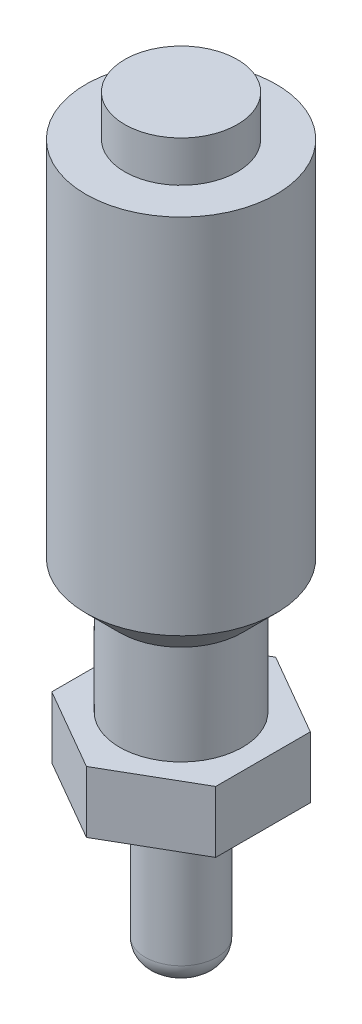
ISO-10303-21;
HEADER;
FILE_DESCRIPTION(('STEP AP214'),'2;1');
FILE_NAME('part.step','',(''),(''),'','','');
FILE_SCHEMA(('AUTOMOTIVE_DESIGN { 1 0 10303 214 1 1 1 1 }'));
ENDSEC;
DATA;
#1=APPLICATION_CONTEXT('core data for automotive mechanical design processes');
#2=APPLICATION_PROTOCOL_DEFINITION('international standard','automotive_design',2000,#1);
#3=PRODUCT_CONTEXT('',#1,'mechanical');
#4=PRODUCT('Part','Part','',(#3));
#5=PRODUCT_RELATED_PRODUCT_CATEGORY('part','',(#4));
#6=PRODUCT_DEFINITION_FORMATION('','',#4);
#7=PRODUCT_DEFINITION_CONTEXT('part definition',#1,'design');
#8=PRODUCT_DEFINITION('design','',#6,#7);
#9=PRODUCT_DEFINITION_SHAPE('','',#8);
#10=(LENGTH_UNIT() NAMED_UNIT(*) SI_UNIT(.MILLI.,.METRE.));
#11=(NAMED_UNIT(*) PLANE_ANGLE_UNIT() SI_UNIT($,.RADIAN.));
#12=(NAMED_UNIT(*) SI_UNIT($,.STERADIAN.) SOLID_ANGLE_UNIT());
#13=UNCERTAINTY_MEASURE_WITH_UNIT(LENGTH_MEASURE(1.E-05),#10,'distance_accuracy_value','');
#14=(GEOMETRIC_REPRESENTATION_CONTEXT(3) GLOBAL_UNCERTAINTY_ASSIGNED_CONTEXT((#13)) GLOBAL_UNIT_ASSIGNED_CONTEXT((#10,
#11,#12)) REPRESENTATION_CONTEXT('',''));
#15=CARTESIAN_POINT('',(0.,0.,0.));
#16=DIRECTION('',(0.,0.,1.));
#17=DIRECTION('',(1.,0.,0.));
#18=AXIS2_PLACEMENT_3D('',#15,#16,#17);
#19=CARTESIAN_POINT('',(0.,36.7,0.));
#20=DIRECTION('',(0.,-1.,0.));
#21=DIRECTION('',(0.,0.,-1.));
#22=AXIS2_PLACEMENT_3D('',#19,#20,#21);
#23=CYLINDRICAL_SURFACE('',#22,4.65);
#24=CARTESIAN_POINT('',(0.,17.,0.));
#25=DIRECTION('',(0.,1.,0.));
#26=DIRECTION('',(0.,0.,1.));
#27=AXIS2_PLACEMENT_3D('',#24,#25,#26);
#28=CIRCLE('',#27,4.65);
#29=CARTESIAN_POINT('',(0.,17.,4.65));
#30=VERTEX_POINT('',#29);
#31=EDGE_CURVE('E54',#30,#30,#28,.T.);
#32=ORIENTED_EDGE('',*,*,#31,.T.);
#33=EDGE_LOOP('',(#32));
#34=FACE_BOUND('',#33,.T.);
#35=CARTESIAN_POINT('',(0.,34.7,0.));
#36=DIRECTION('',(0.,1.,0.));
#37=DIRECTION('',(0.,0.,1.));
#38=AXIS2_PLACEMENT_3D('',#35,#36,#37);
#39=CIRCLE('',#38,4.65);
#40=CARTESIAN_POINT('',(0.,34.7,4.65));
#41=VERTEX_POINT('',#40);
#42=EDGE_CURVE('E143',#41,#41,#39,.T.);
#43=ORIENTED_EDGE('',*,*,#42,.F.);
#44=EDGE_LOOP('',(#43));
#45=FACE_BOUND('',#44,.T.);
#46=ADVANCED_FACE('F43',(#34,#45),#23,.T.);
#47=CARTESIAN_POINT('',(0.,15.,0.));
#48=DIRECTION('',(0.,-1.,0.));
#49=DIRECTION('',(0.,0.,-1.));
#50=AXIS2_PLACEMENT_3D('',#47,#48,#49);
#51=CYLINDRICAL_SURFACE('',#50,3.);
#52=CARTESIAN_POINT('',(0.,15.35,0.));
#53=DIRECTION('',(0.,1.,0.));
#54=DIRECTION('',(0.,0.,1.));
#55=AXIS2_PLACEMENT_3D('',#52,#53,#54);
#56=CIRCLE('',#55,3.);
#57=CARTESIAN_POINT('',(0.,15.35,3.));
#58=VERTEX_POINT('',#57);
#59=EDGE_CURVE('E11',#58,#58,#56,.F.);
#60=ORIENTED_EDGE('',*,*,#59,.T.);
#61=EDGE_LOOP('',(#60));
#62=FACE_BOUND('',#61,.T.);
#63=CARTESIAN_POINT('',(0.,10.5,0.));
#64=DIRECTION('',(0.,-1.,0.));
#65=DIRECTION('',(0.,0.,-1.));
#66=AXIS2_PLACEMENT_3D('',#63,#64,#65);
#67=CIRCLE('',#66,3.);
#68=CARTESIAN_POINT('',(0.,10.5,-3.));
#69=VERTEX_POINT('',#68);
#70=EDGE_CURVE('E184',#69,#69,#67,.T.);
#71=ORIENTED_EDGE('',*,*,#70,.F.);
#72=EDGE_LOOP('',(#71));
#73=FACE_BOUND('',#72,.T.);
#74=ADVANCED_FACE('F204',(#62,#73),#51,.T.);
#75=CARTESIAN_POINT('',(3.99999999999999,10.5,2.30940107675851));
#76=DIRECTION('',(0.5,0.,0.866025403784439));
#77=DIRECTION('',(0.866025403784439,0.,-0.5));
#78=AXIS2_PLACEMENT_3D('',#75,#76,#77);
#79=PLANE('',#78);
#80=DIRECTION('',(-0.866025403784439,0.,0.5));
#81=VECTOR('',#80,1.);
#82=CARTESIAN_POINT('',(3.99999999999999,7.5,2.30940107675851));
#83=LINE('',#82,#81);
#84=CARTESIAN_POINT('',(3.99999999999999,7.5,2.30940107675851));
#85=VERTEX_POINT('',#84);
#86=CARTESIAN_POINT('',(0.,7.5,4.61880215351701));
#87=VERTEX_POINT('',#86);
#88=EDGE_CURVE('E138',#85,#87,#83,.T.);
#89=ORIENTED_EDGE('',*,*,#88,.F.);
#90=DIRECTION('',(0.,-1.,0.));
#91=VECTOR('',#90,1.);
#92=CARTESIAN_POINT('',(3.99999999999999,10.5,2.30940107675851));
#93=LINE('',#92,#91);
#94=CARTESIAN_POINT('',(3.99999999999999,10.5,2.30940107675851));
#95=VERTEX_POINT('',#94);
#96=EDGE_CURVE('E62',#95,#85,#93,.T.);
#97=ORIENTED_EDGE('',*,*,#96,.F.);
#98=DIRECTION('',(-0.866025403784439,0.,0.5));
#99=VECTOR('',#98,1.);
#100=CARTESIAN_POINT('',(3.99999999999999,10.5,2.30940107675851));
#101=LINE('',#100,#99);
#102=CARTESIAN_POINT('',(0.,10.5,4.61880215351701));
#103=VERTEX_POINT('',#102);
#104=EDGE_CURVE('E160',#95,#103,#101,.T.);
#105=ORIENTED_EDGE('',*,*,#104,.T.);
#106=DIRECTION('',(0.,-1.,0.));
#107=VECTOR('',#106,1.);
#108=CARTESIAN_POINT('',(0.,10.5,4.61880215351701));
#109=LINE('',#108,#107);
#110=EDGE_CURVE('E97',#103,#87,#109,.T.);
#111=ORIENTED_EDGE('',*,*,#110,.T.);
#112=EDGE_LOOP('',(#89,#97,#105,#111));
#113=FACE_BOUND('',#112,.T.);
#114=ADVANCED_FACE('F209',(#113),#79,.T.);
#115=CARTESIAN_POINT('',(4.,10.5,-2.3094010767585));
#116=DIRECTION('',(1.,0.,0.));
#117=DIRECTION('',(0.,0.,-1.));
#118=AXIS2_PLACEMENT_3D('',#115,#116,#117);
#119=PLANE('',#118);
#120=DIRECTION('',(0.,0.,1.));
#121=VECTOR('',#120,1.);
#122=CARTESIAN_POINT('',(4.,7.5,-2.3094010767585));
#123=LINE('',#122,#121);
#124=CARTESIAN_POINT('',(4.,7.5,-2.3094010767585));
#125=VERTEX_POINT('',#124);
#126=EDGE_CURVE('E156',#125,#85,#123,.T.);
#127=ORIENTED_EDGE('',*,*,#126,.F.);
#128=DIRECTION('',(0.,-1.,0.));
#129=VECTOR('',#128,1.);
#130=CARTESIAN_POINT('',(4.,10.5,-2.3094010767585));
#131=LINE('',#130,#129);
#132=CARTESIAN_POINT('',(4.,10.5,-2.3094010767585));
#133=VERTEX_POINT('',#132);
#134=EDGE_CURVE('E85',#133,#125,#131,.T.);
#135=ORIENTED_EDGE('',*,*,#134,.F.);
#136=DIRECTION('',(0.,0.,1.));
#137=VECTOR('',#136,1.);
#138=CARTESIAN_POINT('',(4.,10.5,-2.3094010767585));
#139=LINE('',#138,#137);
#140=EDGE_CURVE('E124',#133,#95,#139,.T.);
#141=ORIENTED_EDGE('',*,*,#140,.T.);
#142=ORIENTED_EDGE('',*,*,#96,.T.);
#143=EDGE_LOOP('',(#127,#135,#141,#142));
#144=FACE_BOUND('',#143,.T.);
#145=ADVANCED_FACE('F241',(#144),#119,.T.);
#146=CARTESIAN_POINT('',(0.,10.5,-4.618802153517));
#147=DIRECTION('',(0.5,0.,-0.866025403784439));
#148=DIRECTION('',(-0.866025403784439,0.,-0.5));
#149=AXIS2_PLACEMENT_3D('',#146,#147,#148);
#150=PLANE('',#149);
#151=DIRECTION('',(0.866025403784439,0.,0.5));
#152=VECTOR('',#151,1.);
#153=CARTESIAN_POINT('',(0.,7.5,-4.618802153517));
#154=LINE('',#153,#152);
#155=CARTESIAN_POINT('',(0.,7.5,-4.618802153517));
#156=VERTEX_POINT('',#155);
#157=EDGE_CURVE('E110',#156,#125,#154,.T.);
#158=ORIENTED_EDGE('',*,*,#157,.F.);
#159=DIRECTION('',(0.,-1.,0.));
#160=VECTOR('',#159,1.);
#161=CARTESIAN_POINT('',(0.,10.5,-4.618802153517));
#162=LINE('',#161,#160);
#163=CARTESIAN_POINT('',(0.,10.5,-4.618802153517));
#164=VERTEX_POINT('',#163);
#165=EDGE_CURVE('E105',#164,#156,#162,.T.);
#166=ORIENTED_EDGE('',*,*,#165,.F.);
#167=DIRECTION('',(0.866025403784439,0.,0.5));
#168=VECTOR('',#167,1.);
#169=CARTESIAN_POINT('',(0.,10.5,-4.618802153517));
#170=LINE('',#169,#168);
#171=EDGE_CURVE('E108',#164,#133,#170,.T.);
#172=ORIENTED_EDGE('',*,*,#171,.T.);
#173=ORIENTED_EDGE('',*,*,#134,.T.);
#174=EDGE_LOOP('',(#158,#166,#172,#173));
#175=FACE_BOUND('',#174,.T.);
#176=ADVANCED_FACE('F107',(#175),#150,.T.);
#177=CARTESIAN_POINT('',(-4.,10.5,-2.3094010767585));
#178=DIRECTION('',(-0.5,0.,-0.866025403784439));
#179=DIRECTION('',(-0.866025403784439,0.,0.5));
#180=AXIS2_PLACEMENT_3D('',#177,#178,#179);
#181=PLANE('',#180);
#182=DIRECTION('',(0.866025403784439,0.,-0.5));
#183=VECTOR('',#182,1.);
#184=CARTESIAN_POINT('',(-4.,7.5,-2.3094010767585));
#185=LINE('',#184,#183);
#186=CARTESIAN_POINT('',(-4.,7.5,-2.3094010767585));
#187=VERTEX_POINT('',#186);
#188=EDGE_CURVE('E151',#187,#156,#185,.T.);
#189=ORIENTED_EDGE('',*,*,#188,.F.);
#190=DIRECTION('',(0.,-1.,0.));
#191=VECTOR('',#190,1.);
#192=CARTESIAN_POINT('',(-4.,10.5,-2.3094010767585));
#193=LINE('',#192,#191);
#194=CARTESIAN_POINT('',(-4.,10.5,-2.3094010767585));
#195=VERTEX_POINT('',#194);
#196=EDGE_CURVE('E116',#195,#187,#193,.T.);
#197=ORIENTED_EDGE('',*,*,#196,.F.);
#198=DIRECTION('',(0.866025403784439,0.,-0.5));
#199=VECTOR('',#198,1.);
#200=CARTESIAN_POINT('',(-4.,10.5,-2.3094010767585));
#201=LINE('',#200,#199);
#202=EDGE_CURVE('E122',#195,#164,#201,.T.);
#203=ORIENTED_EDGE('',*,*,#202,.T.);
#204=ORIENTED_EDGE('',*,*,#165,.T.);
#205=EDGE_LOOP('',(#189,#197,#203,#204));
#206=FACE_BOUND('',#205,.T.);
#207=ADVANCED_FACE('F127',(#206),#181,.T.);
#208=CARTESIAN_POINT('',(-4.,10.5,2.3094010767585));
#209=DIRECTION('',(-1.,0.,0.));
#210=DIRECTION('',(0.,0.,1.));
#211=AXIS2_PLACEMENT_3D('',#208,#209,#210);
#212=PLANE('',#211);
#213=DIRECTION('',(0.,0.,-1.));
#214=VECTOR('',#213,1.);
#215=CARTESIAN_POINT('',(-4.,7.5,2.3094010767585));
#216=LINE('',#215,#214);
#217=CARTESIAN_POINT('',(-4.,7.5,2.3094010767585));
#218=VERTEX_POINT('',#217);
#219=EDGE_CURVE('E147',#218,#187,#216,.T.);
#220=ORIENTED_EDGE('',*,*,#219,.F.);
#221=DIRECTION('',(0.,-1.,0.));
#222=VECTOR('',#221,1.);
#223=CARTESIAN_POINT('',(-4.,10.5,2.3094010767585));
#224=LINE('',#223,#222);
#225=CARTESIAN_POINT('',(-4.,10.5,2.3094010767585));
#226=VERTEX_POINT('',#225);
#227=EDGE_CURVE('E168',#226,#218,#224,.T.);
#228=ORIENTED_EDGE('',*,*,#227,.F.);
#229=DIRECTION('',(0.,0.,-1.));
#230=VECTOR('',#229,1.);
#231=CARTESIAN_POINT('',(-4.,10.5,2.3094010767585));
#232=LINE('',#231,#230);
#233=EDGE_CURVE('E129',#226,#195,#232,.T.);
#234=ORIENTED_EDGE('',*,*,#233,.T.);
#235=ORIENTED_EDGE('',*,*,#196,.T.);
#236=EDGE_LOOP('',(#220,#228,#234,#235));
#237=FACE_BOUND('',#236,.T.);
#238=ADVANCED_FACE('F240',(#237),#212,.T.);
#239=CARTESIAN_POINT('',(0.,10.5,4.61880215351701));
#240=DIRECTION('',(-0.5,0.,0.866025403784439));
#241=DIRECTION('',(0.866025403784439,0.,0.5));
#242=AXIS2_PLACEMENT_3D('',#239,#240,#241);
#243=PLANE('',#242);
#244=DIRECTION('',(-0.866025403784438,0.,-0.5));
#245=VECTOR('',#244,1.);
#246=CARTESIAN_POINT('',(0.,7.5,4.61880215351701));
#247=LINE('',#246,#245);
#248=EDGE_CURVE('E142',#87,#218,#247,.T.);
#249=ORIENTED_EDGE('',*,*,#248,.F.);
#250=ORIENTED_EDGE('',*,*,#110,.F.);
#251=DIRECTION('',(-0.866025403784438,0.,-0.5));
#252=VECTOR('',#251,1.);
#253=CARTESIAN_POINT('',(0.,10.5,4.61880215351701));
#254=LINE('',#253,#252);
#255=EDGE_CURVE('E132',#103,#226,#254,.T.);
#256=ORIENTED_EDGE('',*,*,#255,.T.);
#257=ORIENTED_EDGE('',*,*,#227,.T.);
#258=EDGE_LOOP('',(#249,#250,#256,#257));
#259=FACE_BOUND('',#258,.T.);
#260=ADVANCED_FACE('F237',(#259),#243,.T.);
#261=CARTESIAN_POINT('',(0.,10.5,0.));
#262=DIRECTION('',(0.,-1.,0.));
#263=DIRECTION('',(0.,0.,-1.));
#264=AXIS2_PLACEMENT_3D('',#261,#262,#263);
#265=PLANE('',#264);
#266=ORIENTED_EDGE('',*,*,#70,.T.);
#267=EDGE_LOOP('',(#266));
#268=FACE_BOUND('',#267,.T.);
#269=ORIENTED_EDGE('',*,*,#104,.F.);
#270=ORIENTED_EDGE('',*,*,#140,.F.);
#271=ORIENTED_EDGE('',*,*,#171,.F.);
#272=ORIENTED_EDGE('',*,*,#202,.F.);
#273=ORIENTED_EDGE('',*,*,#233,.F.);
#274=ORIENTED_EDGE('',*,*,#255,.F.);
#275=EDGE_LOOP('',(#269,#270,#271,#272,#273,#274));
#276=FACE_BOUND('',#275,.T.);
#277=ADVANCED_FACE('F120',(#268,#276),#265,.F.);
#278=CARTESIAN_POINT('',(0.,0.,0.));
#279=DIRECTION('',(0.,1.,0.));
#280=DIRECTION('',(0.,0.,1.));
#281=AXIS2_PLACEMENT_3D('',#278,#279,#280);
#282=PLANE('',#281);
#283=CARTESIAN_POINT('',(0.,0.,0.));
#284=DIRECTION('',(0.,1.,0.));
#285=DIRECTION('',(0.,0.,1.));
#286=AXIS2_PLACEMENT_3D('',#283,#284,#285);
#287=CIRCLE('',#286,0.75);
#288=CARTESIAN_POINT('',(0.,0.,0.75));
#289=VERTEX_POINT('',#288);
#290=EDGE_CURVE('E180',#289,#289,#287,.F.);
#291=ORIENTED_EDGE('',*,*,#290,.T.);
#292=EDGE_LOOP('',(#291));
#293=FACE_BOUND('',#292,.T.);
#294=ADVANCED_FACE('F220',(#293),#282,.F.);
#295=CARTESIAN_POINT('',(0.,1.,0.));
#296=DIRECTION('',(0.,1.,0.));
#297=DIRECTION('',(0.,0.,1.));
#298=AXIS2_PLACEMENT_3D('',#295,#296,#297);
#299=DEGENERATE_TOROIDAL_SURFACE('',#298,0.75,1.,.T.);
#300=ORIENTED_EDGE('',*,*,#290,.F.);
#301=EDGE_LOOP('',(#300));
#302=FACE_BOUND('',#301,.T.);
#303=CARTESIAN_POINT('',(0.,1.,0.));
#304=DIRECTION('',(0.,1.,0.));
#305=DIRECTION('',(0.,0.,1.));
#306=AXIS2_PLACEMENT_3D('',#303,#304,#305);
#307=CIRCLE('',#306,1.75);
#308=CARTESIAN_POINT('',(0.,1.,1.75));
#309=VERTEX_POINT('',#308);
#310=EDGE_CURVE('E176',#309,#309,#307,.T.);
#311=ORIENTED_EDGE('',*,*,#310,.F.);
#312=EDGE_LOOP('',(#311));
#313=FACE_BOUND('',#312,.T.);
#314=ADVANCED_FACE('F223',(#302,#313),#299,.T.);
#315=CARTESIAN_POINT('',(0.,7.5,0.));
#316=DIRECTION('',(0.,-1.,0.));
#317=DIRECTION('',(0.,0.,-1.));
#318=AXIS2_PLACEMENT_3D('',#315,#316,#317);
#319=CYLINDRICAL_SURFACE('',#318,1.75);
#320=ORIENTED_EDGE('',*,*,#310,.T.);
#321=EDGE_LOOP('',(#320));
#322=FACE_BOUND('',#321,.T.);
#323=CARTESIAN_POINT('',(0.,7.5,0.));
#324=DIRECTION('',(0.,1.,0.));
#325=DIRECTION('',(0.,0.,1.));
#326=AXIS2_PLACEMENT_3D('',#323,#324,#325);
#327=CIRCLE('',#326,1.75);
#328=CARTESIAN_POINT('',(0.,7.5,1.75));
#329=VERTEX_POINT('',#328);
#330=EDGE_CURVE('E163',#329,#329,#327,.T.);
#331=ORIENTED_EDGE('',*,*,#330,.F.);
#332=EDGE_LOOP('',(#331));
#333=FACE_BOUND('',#332,.T.);
#334=ADVANCED_FACE('F217',(#322,#333),#319,.T.);
#335=CARTESIAN_POINT('',(0.,7.5,0.));
#336=DIRECTION('',(0.,1.,0.));
#337=DIRECTION('',(0.,0.,1.));
#338=AXIS2_PLACEMENT_3D('',#335,#336,#337);
#339=PLANE('',#338);
#340=ORIENTED_EDGE('',*,*,#330,.T.);
#341=EDGE_LOOP('',(#340));
#342=FACE_BOUND('',#341,.T.);
#343=ORIENTED_EDGE('',*,*,#88,.T.);
#344=ORIENTED_EDGE('',*,*,#248,.T.);
#345=ORIENTED_EDGE('',*,*,#219,.T.);
#346=ORIENTED_EDGE('',*,*,#188,.T.);
#347=ORIENTED_EDGE('',*,*,#157,.T.);
#348=ORIENTED_EDGE('',*,*,#126,.T.);
#349=EDGE_LOOP('',(#343,#344,#345,#346,#347,#348));
#350=FACE_BOUND('',#349,.T.);
#351=ADVANCED_FACE('F214',(#342,#350),#339,.F.);
#352=CARTESIAN_POINT('',(0.,34.7,0.));
#353=DIRECTION('',(0.,1.,0.));
#354=DIRECTION('',(0.,0.,1.));
#355=AXIS2_PLACEMENT_3D('',#352,#353,#354);
#356=PLANE('',#355);
#357=CARTESIAN_POINT('',(0.,34.7,0.));
#358=DIRECTION('',(0.,1.,0.));
#359=DIRECTION('',(0.,0.,1.));
#360=AXIS2_PLACEMENT_3D('',#357,#358,#359);
#361=CIRCLE('',#360,2.75);
#362=CARTESIAN_POINT('',(0.,34.7,2.75));
#363=VERTEX_POINT('',#362);
#364=EDGE_CURVE('E374',#363,#363,#361,.T.);
#365=ORIENTED_EDGE('',*,*,#364,.F.);
#366=EDGE_LOOP('',(#365));
#367=FACE_BOUND('',#366,.T.);
#368=ORIENTED_EDGE('',*,*,#42,.T.);
#369=EDGE_LOOP('',(#368));
#370=FACE_BOUND('',#369,.T.);
#371=ADVANCED_FACE('F216',(#367,#370),#356,.T.);
#372=CARTESIAN_POINT('',(0.,34.7,0.));
#373=DIRECTION('',(0.,1.,0.));
#374=DIRECTION('',(0.,0.,1.));
#375=AXIS2_PLACEMENT_3D('',#372,#373,#374);
#376=CYLINDRICAL_SURFACE('',#375,2.75);
#377=ORIENTED_EDGE('',*,*,#364,.T.);
#378=EDGE_LOOP('',(#377));
#379=FACE_BOUND('',#378,.T.);
#380=CARTESIAN_POINT('',(0.,36.7,0.));
#381=DIRECTION('',(0.,1.,0.));
#382=DIRECTION('',(0.,0.,1.));
#383=AXIS2_PLACEMENT_3D('',#380,#381,#382);
#384=CIRCLE('',#383,2.75);
#385=CARTESIAN_POINT('',(0.,36.7,2.75));
#386=VERTEX_POINT('',#385);
#387=EDGE_CURVE('E377',#386,#386,#384,.T.);
#388=ORIENTED_EDGE('',*,*,#387,.F.);
#389=EDGE_LOOP('',(#388));
#390=FACE_BOUND('',#389,.T.);
#391=ADVANCED_FACE('F199',(#379,#390),#376,.T.);
#392=CARTESIAN_POINT('',(0.,36.7,0.));
#393=DIRECTION('',(0.,1.,0.));
#394=DIRECTION('',(0.,0.,1.));
#395=AXIS2_PLACEMENT_3D('',#392,#393,#394);
#396=PLANE('',#395);
#397=ORIENTED_EDGE('',*,*,#387,.T.);
#398=EDGE_LOOP('',(#397));
#399=FACE_BOUND('',#398,.T.);
#400=ADVANCED_FACE('F194',(#399),#396,.T.);
#401=CARTESIAN_POINT('',(0.,17.,0.));
#402=DIRECTION('',(0.,1.,0.));
#403=DIRECTION('',(0.,0.,1.));
#404=AXIS2_PLACEMENT_3D('',#401,#402,#403);
#405=CONICAL_SURFACE('',#404,4.65,0.785398163397443);
#406=ORIENTED_EDGE('',*,*,#59,.F.);
#407=EDGE_LOOP('',(#406));
#408=FACE_BOUND('',#407,.T.);
#409=ORIENTED_EDGE('',*,*,#31,.F.);
#410=EDGE_LOOP('',(#409));
#411=FACE_BOUND('',#410,.T.);
#412=ADVANCED_FACE('F46',(#408,#411),#405,.T.);
#413=CLOSED_SHELL('',(#46,#74,#114,#145,#176,#207,#238,#260,#277,#294,#314,#334,#351,#371,#391,
#400,#412));
#414=MANIFOLD_SOLID_BREP('B2',#413);
#415=ADVANCED_BREP_SHAPE_REPRESENTATION('',(#18,#414),#14);
#416=SHAPE_DEFINITION_REPRESENTATION(#9,#415);
ENDSEC;
END-ISO-10303-21;
